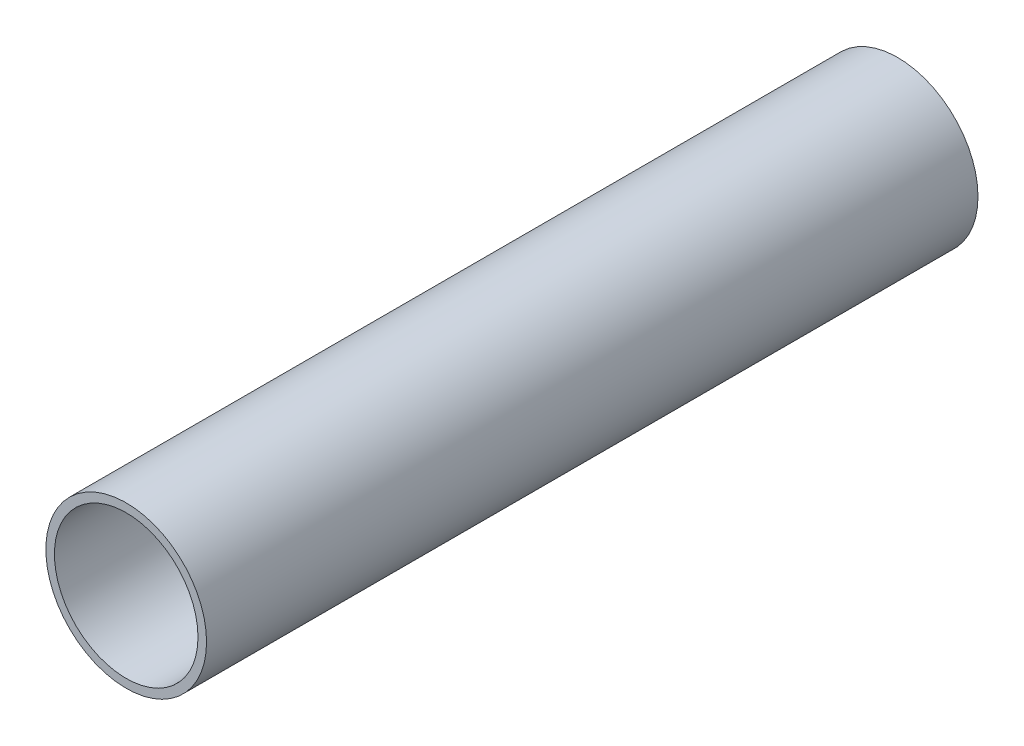
ISO-10303-21;
HEADER;
FILE_DESCRIPTION(('STEP AP214'),'2;1');
FILE_NAME('part.step','',(''),(''),'','','');
FILE_SCHEMA(('AUTOMOTIVE_DESIGN { 1 0 10303 214 1 1 1 1 }'));
ENDSEC;
DATA;
#1=APPLICATION_CONTEXT('core data for automotive mechanical design processes');
#2=APPLICATION_PROTOCOL_DEFINITION('international standard','automotive_design',2000,#1);
#3=PRODUCT_CONTEXT('',#1,'mechanical');
#4=PRODUCT('Part','Part','',(#3));
#5=PRODUCT_RELATED_PRODUCT_CATEGORY('part','',(#4));
#6=PRODUCT_DEFINITION_FORMATION('','',#4);
#7=PRODUCT_DEFINITION_CONTEXT('part definition',#1,'design');
#8=PRODUCT_DEFINITION('design','',#6,#7);
#9=PRODUCT_DEFINITION_SHAPE('','',#8);
#10=(LENGTH_UNIT() NAMED_UNIT(*) SI_UNIT(.MILLI.,.METRE.));
#11=(NAMED_UNIT(*) PLANE_ANGLE_UNIT() SI_UNIT($,.RADIAN.));
#12=(NAMED_UNIT(*) SI_UNIT($,.STERADIAN.) SOLID_ANGLE_UNIT());
#13=UNCERTAINTY_MEASURE_WITH_UNIT(LENGTH_MEASURE(1.E-05),#10,'distance_accuracy_value','');
#14=(GEOMETRIC_REPRESENTATION_CONTEXT(3) GLOBAL_UNCERTAINTY_ASSIGNED_CONTEXT((#13)) GLOBAL_UNIT_ASSIGNED_CONTEXT((#10,
#11,#12)) REPRESENTATION_CONTEXT('',''));
#15=CARTESIAN_POINT('',(0.,0.,0.));
#16=DIRECTION('',(0.,0.,1.));
#17=DIRECTION('',(1.,0.,0.));
#18=AXIS2_PLACEMENT_3D('',#15,#16,#17);
#19=CARTESIAN_POINT('',(0.,0.,18.));
#20=DIRECTION('',(0.,0.,1.));
#21=DIRECTION('',(1.,0.,0.));
#22=AXIS2_PLACEMENT_3D('',#19,#20,#21);
#23=PLANE('',#22);
#24=CARTESIAN_POINT('',(0.,0.,18.));
#25=DIRECTION('',(0.,0.,1.));
#26=DIRECTION('',(1.,0.,0.));
#27=AXIS2_PLACEMENT_3D('',#24,#25,#26);
#28=CIRCLE('',#27,1.875);
#29=CARTESIAN_POINT('',(1.875,0.,18.));
#30=VERTEX_POINT('',#29);
#31=EDGE_CURVE('E10',#30,#30,#28,.T.);
#32=ORIENTED_EDGE('',*,*,#31,.T.);
#33=EDGE_LOOP('',(#32));
#34=FACE_BOUND('',#33,.T.);
#35=CARTESIAN_POINT('',(0.,0.,18.));
#36=DIRECTION('',(0.,0.,1.));
#37=DIRECTION('',(1.,0.,0.));
#38=AXIS2_PLACEMENT_3D('',#35,#36,#37);
#39=CIRCLE('',#38,1.675);
#40=CARTESIAN_POINT('',(1.675,0.,18.));
#41=VERTEX_POINT('',#40);
#42=EDGE_CURVE('E45',#41,#41,#39,.T.);
#43=ORIENTED_EDGE('',*,*,#42,.F.);
#44=EDGE_LOOP('',(#43));
#45=FACE_BOUND('',#44,.T.);
#46=ADVANCED_FACE('F34',(#34,#45),#23,.T.);
#47=CARTESIAN_POINT('',(0.,0.,0.));
#48=DIRECTION('',(0.,0.,1.));
#49=DIRECTION('',(1.,0.,0.));
#50=AXIS2_PLACEMENT_3D('',#47,#48,#49);
#51=PLANE('',#50);
#52=CARTESIAN_POINT('',(0.,0.,0.));
#53=DIRECTION('',(0.,0.,1.));
#54=DIRECTION('',(1.,0.,0.));
#55=AXIS2_PLACEMENT_3D('',#52,#53,#54);
#56=CIRCLE('',#55,1.875);
#57=CARTESIAN_POINT('',(1.875,0.,0.));
#58=VERTEX_POINT('',#57);
#59=EDGE_CURVE('E38',#58,#58,#56,.T.);
#60=ORIENTED_EDGE('',*,*,#59,.F.);
#61=EDGE_LOOP('',(#60));
#62=FACE_BOUND('',#61,.T.);
#63=CARTESIAN_POINT('',(0.,0.,0.));
#64=DIRECTION('',(0.,0.,1.));
#65=DIRECTION('',(1.,0.,0.));
#66=AXIS2_PLACEMENT_3D('',#63,#64,#65);
#67=CIRCLE('',#66,1.675);
#68=CARTESIAN_POINT('',(1.675,0.,0.));
#69=VERTEX_POINT('',#68);
#70=EDGE_CURVE('E47',#69,#69,#67,.T.);
#71=ORIENTED_EDGE('',*,*,#70,.T.);
#72=EDGE_LOOP('',(#71));
#73=FACE_BOUND('',#72,.T.);
#74=ADVANCED_FACE('F57',(#62,#73),#51,.F.);
#75=CARTESIAN_POINT('',(0.,0.,18.));
#76=DIRECTION('',(0.,0.,-1.));
#77=DIRECTION('',(-1.,0.,0.));
#78=AXIS2_PLACEMENT_3D('',#75,#76,#77);
#79=CYLINDRICAL_SURFACE('',#78,1.875);
#80=ORIENTED_EDGE('',*,*,#31,.F.);
#81=EDGE_LOOP('',(#80));
#82=FACE_BOUND('',#81,.T.);
#83=ORIENTED_EDGE('',*,*,#59,.T.);
#84=EDGE_LOOP('',(#83));
#85=FACE_BOUND('',#84,.T.);
#86=ADVANCED_FACE('F36',(#82,#85),#79,.T.);
#87=CARTESIAN_POINT('',(0.,0.,18.));
#88=DIRECTION('',(0.,0.,-1.));
#89=DIRECTION('',(-1.,0.,0.));
#90=AXIS2_PLACEMENT_3D('',#87,#88,#89);
#91=CYLINDRICAL_SURFACE('',#90,1.675);
#92=ORIENTED_EDGE('',*,*,#42,.T.);
#93=EDGE_LOOP('',(#92));
#94=FACE_BOUND('',#93,.T.);
#95=ORIENTED_EDGE('',*,*,#70,.F.);
#96=EDGE_LOOP('',(#95));
#97=FACE_BOUND('',#96,.T.);
#98=ADVANCED_FACE('F53',(#94,#97),#91,.F.);
#99=CLOSED_SHELL('',(#46,#74,#86,#98));
#100=MANIFOLD_SOLID_BREP('B2',#99);
#101=ADVANCED_BREP_SHAPE_REPRESENTATION('',(#18,#100),#14);
#102=SHAPE_DEFINITION_REPRESENTATION(#9,#101);
ENDSEC;
END-ISO-10303-21;
